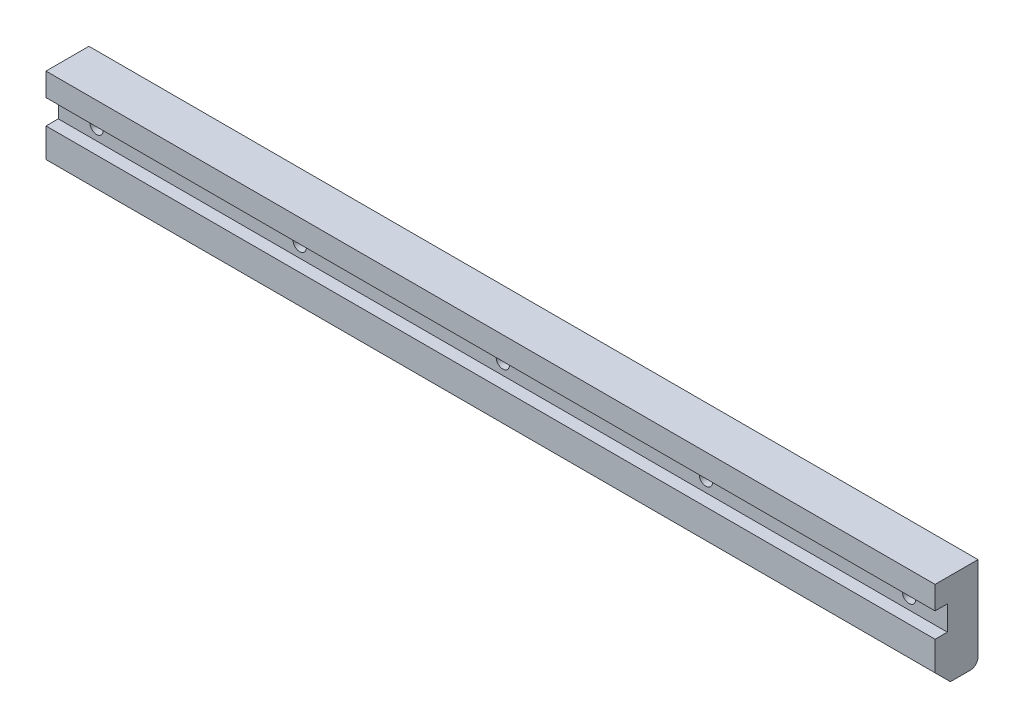
ISO-10303-21;
HEADER;
FILE_DESCRIPTION(('STEP AP214'),'2;1');
FILE_NAME('part.step','',(''),(''),'','','');
FILE_SCHEMA(('AUTOMOTIVE_DESIGN { 1 0 10303 214 1 1 1 1 }'));
ENDSEC;
DATA;
#1=APPLICATION_CONTEXT('core data for automotive mechanical design processes');
#2=APPLICATION_PROTOCOL_DEFINITION('international standard','automotive_design',2000,#1);
#3=PRODUCT_CONTEXT('',#1,'mechanical');
#4=PRODUCT('Part','Part','',(#3));
#5=PRODUCT_RELATED_PRODUCT_CATEGORY('part','',(#4));
#6=PRODUCT_DEFINITION_FORMATION('','',#4);
#7=PRODUCT_DEFINITION_CONTEXT('part definition',#1,'design');
#8=PRODUCT_DEFINITION('design','',#6,#7);
#9=PRODUCT_DEFINITION_SHAPE('','',#8);
#10=(LENGTH_UNIT() NAMED_UNIT(*) SI_UNIT(.MILLI.,.METRE.));
#11=(NAMED_UNIT(*) PLANE_ANGLE_UNIT() SI_UNIT($,.RADIAN.));
#12=(NAMED_UNIT(*) SI_UNIT($,.STERADIAN.) SOLID_ANGLE_UNIT());
#13=UNCERTAINTY_MEASURE_WITH_UNIT(LENGTH_MEASURE(1.E-05),#10,'distance_accuracy_value','');
#14=(GEOMETRIC_REPRESENTATION_CONTEXT(3) GLOBAL_UNCERTAINTY_ASSIGNED_CONTEXT((#13)) GLOBAL_UNIT_ASSIGNED_CONTEXT((#10,
#11,#12)) REPRESENTATION_CONTEXT('',''));
#15=CARTESIAN_POINT('',(0.,0.,0.));
#16=DIRECTION('',(0.,0.,1.));
#17=DIRECTION('',(1.,0.,0.));
#18=AXIS2_PLACEMENT_3D('',#15,#16,#17);
#19=CARTESIAN_POINT('',(265.,37.,20.));
#20=DIRECTION('',(0.,0.,1.));
#21=DIRECTION('',(1.,0.,0.));
#22=AXIS2_PLACEMENT_3D('',#19,#20,#21);
#23=CYLINDRICAL_SURFACE('',#22,4.32349999999998);
#24=CARTESIAN_POINT('',(265.,37.,0.));
#25=DIRECTION('',(0.,0.,-1.));
#26=DIRECTION('',(-1.,0.,0.));
#27=AXIS2_PLACEMENT_3D('',#24,#25,#26);
#28=CIRCLE('',#27,4.32349999999998);
#29=CARTESIAN_POINT('',(260.6765,37.,0.));
#30=VERTEX_POINT('',#29);
#31=EDGE_CURVE('E195',#30,#30,#28,.T.);
#32=ORIENTED_EDGE('',*,*,#31,.T.);
#33=EDGE_LOOP('',(#32));
#34=FACE_BOUND('',#33,.T.);
#35=CARTESIAN_POINT('',(265.,37.,20.));
#36=DIRECTION('',(0.,0.,1.));
#37=DIRECTION('',(1.,0.,0.));
#38=AXIS2_PLACEMENT_3D('',#35,#36,#37);
#39=CIRCLE('',#38,4.32349999999998);
#40=CARTESIAN_POINT('',(269.3235,37.,20.));
#41=VERTEX_POINT('',#40);
#42=EDGE_CURVE('E198',#41,#41,#39,.T.);
#43=ORIENTED_EDGE('',*,*,#42,.T.);
#44=EDGE_LOOP('',(#43));
#45=FACE_BOUND('',#44,.T.);
#46=ADVANCED_FACE('F33',(#34,#45),#23,.F.);
#47=CARTESIAN_POINT('',(132.5,37.,20.));
#48=DIRECTION('',(0.,0.,1.));
#49=DIRECTION('',(1.,0.,0.));
#50=AXIS2_PLACEMENT_3D('',#47,#48,#49);
#51=CYLINDRICAL_SURFACE('',#50,4.32349999999998);
#52=CARTESIAN_POINT('',(132.5,37.,0.));
#53=DIRECTION('',(0.,0.,-1.));
#54=DIRECTION('',(-1.,0.,0.));
#55=AXIS2_PLACEMENT_3D('',#52,#53,#54);
#56=CIRCLE('',#55,4.32349999999998);
#57=CARTESIAN_POINT('',(128.1765,37.,0.));
#58=VERTEX_POINT('',#57);
#59=EDGE_CURVE('E189',#58,#58,#56,.T.);
#60=ORIENTED_EDGE('',*,*,#59,.T.);
#61=EDGE_LOOP('',(#60));
#62=FACE_BOUND('',#61,.T.);
#63=CARTESIAN_POINT('',(132.5,37.,20.));
#64=DIRECTION('',(0.,0.,1.));
#65=DIRECTION('',(1.,0.,0.));
#66=AXIS2_PLACEMENT_3D('',#63,#64,#65);
#67=CIRCLE('',#66,4.32349999999998);
#68=CARTESIAN_POINT('',(136.8235,37.,20.));
#69=VERTEX_POINT('',#68);
#70=EDGE_CURVE('E192',#69,#69,#67,.T.);
#71=ORIENTED_EDGE('',*,*,#70,.T.);
#72=EDGE_LOOP('',(#71));
#73=FACE_BOUND('',#72,.T.);
#74=ADVANCED_FACE('F257',(#62,#73),#51,.F.);
#75=CARTESIAN_POINT('',(0.,37.,20.));
#76=DIRECTION('',(0.,0.,1.));
#77=DIRECTION('',(1.,0.,0.));
#78=AXIS2_PLACEMENT_3D('',#75,#76,#77);
#79=CYLINDRICAL_SURFACE('',#78,4.32349999999998);
#80=CARTESIAN_POINT('',(0.,37.,0.));
#81=DIRECTION('',(0.,0.,-1.));
#82=DIRECTION('',(-1.,0.,0.));
#83=AXIS2_PLACEMENT_3D('',#80,#81,#82);
#84=CIRCLE('',#83,4.32349999999998);
#85=CARTESIAN_POINT('',(-4.32349999999998,37.,0.));
#86=VERTEX_POINT('',#85);
#87=EDGE_CURVE('E172',#86,#86,#84,.T.);
#88=ORIENTED_EDGE('',*,*,#87,.T.);
#89=EDGE_LOOP('',(#88));
#90=FACE_BOUND('',#89,.T.);
#91=CARTESIAN_POINT('',(0.,37.,20.));
#92=DIRECTION('',(0.,0.,1.));
#93=DIRECTION('',(1.,0.,0.));
#94=AXIS2_PLACEMENT_3D('',#91,#92,#93);
#95=CIRCLE('',#94,4.32349999999998);
#96=CARTESIAN_POINT('',(4.32349999999998,37.,20.));
#97=VERTEX_POINT('',#96);
#98=EDGE_CURVE('E186',#97,#97,#95,.T.);
#99=ORIENTED_EDGE('',*,*,#98,.T.);
#100=EDGE_LOOP('',(#99));
#101=FACE_BOUND('',#100,.T.);
#102=ADVANCED_FACE('F262',(#90,#101),#79,.F.);
#103=CARTESIAN_POINT('',(-290.,0.,18.));
#104=DIRECTION('',(0.,-1.,0.));
#105=DIRECTION('',(0.,0.,-1.));
#106=AXIS2_PLACEMENT_3D('',#103,#104,#105);
#107=PLANE('',#106);
#108=DIRECTION('',(0.,0.,-1.));
#109=VECTOR('',#108,1.);
#110=CARTESIAN_POINT('',(-290.,0.,18.));
#111=LINE('',#110,#109);
#112=CARTESIAN_POINT('',(-290.,0.,18.));
#113=VERTEX_POINT('',#112);
#114=CARTESIAN_POINT('',(-290.,0.,5.));
#115=VERTEX_POINT('',#114);
#116=EDGE_CURVE('E147',#113,#115,#111,.T.);
#117=ORIENTED_EDGE('',*,*,#116,.T.);
#118=DIRECTION('',(1.,0.,0.));
#119=VECTOR('',#118,1.);
#120=CARTESIAN_POINT('',(-290.,0.,5.));
#121=LINE('',#120,#119);
#122=CARTESIAN_POINT('',(290.,0.,5.));
#123=VERTEX_POINT('',#122);
#124=EDGE_CURVE('E201',#115,#123,#121,.T.);
#125=ORIENTED_EDGE('',*,*,#124,.T.);
#126=DIRECTION('',(0.,0.,-1.));
#127=VECTOR('',#126,1.);
#128=CARTESIAN_POINT('',(290.,0.,18.));
#129=LINE('',#128,#127);
#130=CARTESIAN_POINT('',(290.,0.,18.));
#131=VERTEX_POINT('',#130);
#132=EDGE_CURVE('E113',#131,#123,#129,.T.);
#133=ORIENTED_EDGE('',*,*,#132,.F.);
#134=DIRECTION('',(1.,0.,0.));
#135=VECTOR('',#134,1.);
#136=CARTESIAN_POINT('',(-290.,0.,18.));
#137=LINE('',#136,#135);
#138=EDGE_CURVE('E170',#113,#131,#137,.T.);
#139=ORIENTED_EDGE('',*,*,#138,.F.);
#140=EDGE_LOOP('',(#117,#125,#133,#139));
#141=FACE_BOUND('',#140,.T.);
#142=ADVANCED_FACE('F207',(#141),#107,.T.);
#143=CARTESIAN_POINT('',(-290.,10.,28.));
#144=DIRECTION('',(0.,-0.707106781186547,0.707106781186548));
#145=DIRECTION('',(0.,-0.707106781186548,-0.707106781186547));
#146=AXIS2_PLACEMENT_3D('',#143,#144,#145);
#147=PLANE('',#146);
#148=ORIENTED_EDGE('',*,*,#138,.T.);
#149=DIRECTION('',(0.,-0.707106781186548,-0.707106781186547));
#150=VECTOR('',#149,1.);
#151=CARTESIAN_POINT('',(290.,10.,28.));
#152=LINE('',#151,#150);
#153=CARTESIAN_POINT('',(290.,10.,28.));
#154=VERTEX_POINT('',#153);
#155=EDGE_CURVE('E144',#154,#131,#152,.T.);
#156=ORIENTED_EDGE('',*,*,#155,.F.);
#157=DIRECTION('',(1.,0.,0.));
#158=VECTOR('',#157,1.);
#159=CARTESIAN_POINT('',(-290.,10.,28.));
#160=LINE('',#159,#158);
#161=CARTESIAN_POINT('',(-290.,10.,28.));
#162=VERTEX_POINT('',#161);
#163=EDGE_CURVE('E173',#162,#154,#160,.T.);
#164=ORIENTED_EDGE('',*,*,#163,.F.);
#165=DIRECTION('',(0.,-0.707106781186548,-0.707106781186547));
#166=VECTOR('',#165,1.);
#167=CARTESIAN_POINT('',(-290.,10.,28.));
#168=LINE('',#167,#166);
#169=EDGE_CURVE('E124',#162,#113,#168,.T.);
#170=ORIENTED_EDGE('',*,*,#169,.T.);
#171=EDGE_LOOP('',(#148,#156,#164,#170));
#172=FACE_BOUND('',#171,.T.);
#173=ADVANCED_FACE('F270',(#172),#147,.T.);
#174=CARTESIAN_POINT('',(-290.,29.,28.));
#175=DIRECTION('',(0.,0.,1.));
#176=DIRECTION('',(0.,-1.,0.));
#177=AXIS2_PLACEMENT_3D('',#174,#175,#176);
#178=PLANE('',#177);
#179=ORIENTED_EDGE('',*,*,#163,.T.);
#180=DIRECTION('',(0.,-1.,0.));
#181=VECTOR('',#180,1.);
#182=CARTESIAN_POINT('',(290.,29.,28.));
#183=LINE('',#182,#181);
#184=CARTESIAN_POINT('',(290.,29.,28.));
#185=VERTEX_POINT('',#184);
#186=EDGE_CURVE('E141',#185,#154,#183,.T.);
#187=ORIENTED_EDGE('',*,*,#186,.F.);
#188=DIRECTION('',(1.,0.,0.));
#189=VECTOR('',#188,1.);
#190=CARTESIAN_POINT('',(-290.,29.,28.));
#191=LINE('',#190,#189);
#192=CARTESIAN_POINT('',(-290.,29.,28.));
#193=VERTEX_POINT('',#192);
#194=EDGE_CURVE('E175',#193,#185,#191,.T.);
#195=ORIENTED_EDGE('',*,*,#194,.F.);
#196=DIRECTION('',(0.,-1.,0.));
#197=VECTOR('',#196,1.);
#198=CARTESIAN_POINT('',(-290.,29.,28.));
#199=LINE('',#198,#197);
#200=EDGE_CURVE('E165',#193,#162,#199,.T.);
#201=ORIENTED_EDGE('',*,*,#200,.T.);
#202=EDGE_LOOP('',(#179,#187,#195,#201));
#203=FACE_BOUND('',#202,.T.);
#204=ADVANCED_FACE('F283',(#203),#178,.T.);
#205=CARTESIAN_POINT('',(-290.,29.,20.));
#206=DIRECTION('',(0.,1.,0.));
#207=DIRECTION('',(0.,0.,1.));
#208=AXIS2_PLACEMENT_3D('',#205,#206,#207);
#209=PLANE('',#208);
#210=ORIENTED_EDGE('',*,*,#194,.T.);
#211=DIRECTION('',(0.,0.,1.));
#212=VECTOR('',#211,1.);
#213=CARTESIAN_POINT('',(290.,29.,20.));
#214=LINE('',#213,#212);
#215=CARTESIAN_POINT('',(290.,29.,20.));
#216=VERTEX_POINT('',#215);
#217=EDGE_CURVE('E138',#216,#185,#214,.T.);
#218=ORIENTED_EDGE('',*,*,#217,.F.);
#219=DIRECTION('',(1.,0.,0.));
#220=VECTOR('',#219,1.);
#221=CARTESIAN_POINT('',(-290.,29.,20.));
#222=LINE('',#221,#220);
#223=CARTESIAN_POINT('',(-290.,29.,20.));
#224=VERTEX_POINT('',#223);
#225=EDGE_CURVE('E177',#224,#216,#222,.T.);
#226=ORIENTED_EDGE('',*,*,#225,.F.);
#227=DIRECTION('',(0.,0.,1.));
#228=VECTOR('',#227,1.);
#229=CARTESIAN_POINT('',(-290.,29.,20.));
#230=LINE('',#229,#228);
#231=EDGE_CURVE('E162',#224,#193,#230,.T.);
#232=ORIENTED_EDGE('',*,*,#231,.T.);
#233=EDGE_LOOP('',(#210,#218,#226,#232));
#234=FACE_BOUND('',#233,.T.);
#235=ADVANCED_FACE('F245',(#234),#209,.T.);
#236=CARTESIAN_POINT('',(-290.,45.,20.));
#237=DIRECTION('',(0.,0.,1.));
#238=DIRECTION('',(1.,0.,0.));
#239=AXIS2_PLACEMENT_3D('',#236,#237,#238);
#240=PLANE('',#239);
#241=CARTESIAN_POINT('',(-132.5,37.,20.));
#242=DIRECTION('',(0.,0.,1.));
#243=DIRECTION('',(1.,0.,0.));
#244=AXIS2_PLACEMENT_3D('',#241,#242,#243);
#245=CIRCLE('',#244,4.32349999999998);
#246=CARTESIAN_POINT('',(-128.1765,37.,20.));
#247=VERTEX_POINT('',#246);
#248=EDGE_CURVE('E219',#247,#247,#245,.T.);
#249=ORIENTED_EDGE('',*,*,#248,.F.);
#250=EDGE_LOOP('',(#249));
#251=FACE_BOUND('',#250,.T.);
#252=CARTESIAN_POINT('',(-265.,37.,20.));
#253=DIRECTION('',(0.,0.,1.));
#254=DIRECTION('',(1.,0.,0.));
#255=AXIS2_PLACEMENT_3D('',#252,#253,#254);
#256=CIRCLE('',#255,4.32349999999998);
#257=CARTESIAN_POINT('',(-260.6765,37.,20.));
#258=VERTEX_POINT('',#257);
#259=EDGE_CURVE('E214',#258,#258,#256,.T.);
#260=ORIENTED_EDGE('',*,*,#259,.F.);
#261=EDGE_LOOP('',(#260));
#262=FACE_BOUND('',#261,.T.);
#263=ORIENTED_EDGE('',*,*,#225,.T.);
#264=DIRECTION('',(0.,-1.,0.));
#265=VECTOR('',#264,1.);
#266=CARTESIAN_POINT('',(290.,45.,20.));
#267=LINE('',#266,#265);
#268=CARTESIAN_POINT('',(290.,45.,20.));
#269=VERTEX_POINT('',#268);
#270=EDGE_CURVE('E135',#269,#216,#267,.T.);
#271=ORIENTED_EDGE('',*,*,#270,.F.);
#272=DIRECTION('',(1.,0.,0.));
#273=VECTOR('',#272,1.);
#274=CARTESIAN_POINT('',(-290.,45.,20.));
#275=LINE('',#274,#273);
#276=CARTESIAN_POINT('',(-290.,45.,20.));
#277=VERTEX_POINT('',#276);
#278=EDGE_CURVE('E179',#277,#269,#275,.T.);
#279=ORIENTED_EDGE('',*,*,#278,.F.);
#280=DIRECTION('',(0.,-1.,0.));
#281=VECTOR('',#280,1.);
#282=CARTESIAN_POINT('',(-290.,45.,20.));
#283=LINE('',#282,#281);
#284=EDGE_CURVE('E159',#277,#224,#283,.T.);
#285=ORIENTED_EDGE('',*,*,#284,.T.);
#286=EDGE_LOOP('',(#263,#271,#279,#285));
#287=FACE_BOUND('',#286,.T.);
#288=ORIENTED_EDGE('',*,*,#98,.F.);
#289=EDGE_LOOP('',(#288));
#290=FACE_BOUND('',#289,.T.);
#291=ORIENTED_EDGE('',*,*,#70,.F.);
#292=EDGE_LOOP('',(#291));
#293=FACE_BOUND('',#292,.T.);
#294=ORIENTED_EDGE('',*,*,#42,.F.);
#295=EDGE_LOOP('',(#294));
#296=FACE_BOUND('',#295,.T.);
#297=ADVANCED_FACE('F241',(#251,#262,#287,#290,#293,#296),#240,.T.);
#298=CARTESIAN_POINT('',(-290.,45.,28.));
#299=DIRECTION('',(0.,-1.,0.));
#300=DIRECTION('',(0.,0.,-1.));
#301=AXIS2_PLACEMENT_3D('',#298,#299,#300);
#302=PLANE('',#301);
#303=ORIENTED_EDGE('',*,*,#278,.T.);
#304=DIRECTION('',(0.,0.,-1.));
#305=VECTOR('',#304,1.);
#306=CARTESIAN_POINT('',(290.,45.,28.));
#307=LINE('',#306,#305);
#308=CARTESIAN_POINT('',(290.,45.,28.));
#309=VERTEX_POINT('',#308);
#310=EDGE_CURVE('E129',#309,#269,#307,.T.);
#311=ORIENTED_EDGE('',*,*,#310,.F.);
#312=DIRECTION('',(1.,0.,0.));
#313=VECTOR('',#312,1.);
#314=CARTESIAN_POINT('',(-290.,45.,28.));
#315=LINE('',#314,#313);
#316=CARTESIAN_POINT('',(-290.,45.,28.));
#317=VERTEX_POINT('',#316);
#318=EDGE_CURVE('E181',#317,#309,#315,.T.);
#319=ORIENTED_EDGE('',*,*,#318,.F.);
#320=DIRECTION('',(0.,0.,-1.));
#321=VECTOR('',#320,1.);
#322=CARTESIAN_POINT('',(-290.,45.,28.));
#323=LINE('',#322,#321);
#324=EDGE_CURVE('E156',#317,#277,#323,.T.);
#325=ORIENTED_EDGE('',*,*,#324,.T.);
#326=EDGE_LOOP('',(#303,#311,#319,#325));
#327=FACE_BOUND('',#326,.T.);
#328=ADVANCED_FACE('F244',(#327),#302,.T.);
#329=CARTESIAN_POINT('',(-290.,60.,28.));
#330=DIRECTION('',(0.,0.,1.));
#331=DIRECTION('',(1.,0.,0.));
#332=AXIS2_PLACEMENT_3D('',#329,#330,#331);
#333=PLANE('',#332);
#334=ORIENTED_EDGE('',*,*,#318,.T.);
#335=DIRECTION('',(0.,-1.,0.));
#336=VECTOR('',#335,1.);
#337=CARTESIAN_POINT('',(290.,60.,28.));
#338=LINE('',#337,#336);
#339=CARTESIAN_POINT('',(290.,60.,28.));
#340=VERTEX_POINT('',#339);
#341=EDGE_CURVE('E127',#340,#309,#338,.T.);
#342=ORIENTED_EDGE('',*,*,#341,.F.);
#343=DIRECTION('',(1.,0.,0.));
#344=VECTOR('',#343,1.);
#345=CARTESIAN_POINT('',(-290.,60.,28.));
#346=LINE('',#345,#344);
#347=CARTESIAN_POINT('',(-290.,60.,28.));
#348=VERTEX_POINT('',#347);
#349=EDGE_CURVE('E123',#348,#340,#346,.T.);
#350=ORIENTED_EDGE('',*,*,#349,.F.);
#351=DIRECTION('',(0.,-1.,0.));
#352=VECTOR('',#351,1.);
#353=CARTESIAN_POINT('',(-290.,60.,28.));
#354=LINE('',#353,#352);
#355=EDGE_CURVE('E153',#348,#317,#354,.T.);
#356=ORIENTED_EDGE('',*,*,#355,.T.);
#357=EDGE_LOOP('',(#334,#342,#350,#356));
#358=FACE_BOUND('',#357,.T.);
#359=ADVANCED_FACE('F274',(#358),#333,.T.);
#360=CARTESIAN_POINT('',(-290.,60.,0.));
#361=DIRECTION('',(0.,1.,0.));
#362=DIRECTION('',(0.,0.,1.));
#363=AXIS2_PLACEMENT_3D('',#360,#361,#362);
#364=PLANE('',#363);
#365=ORIENTED_EDGE('',*,*,#349,.T.);
#366=DIRECTION('',(0.,0.,1.));
#367=VECTOR('',#366,1.);
#368=CARTESIAN_POINT('',(290.,60.,0.));
#369=LINE('',#368,#367);
#370=CARTESIAN_POINT('',(290.,60.,0.));
#371=VERTEX_POINT('',#370);
#372=EDGE_CURVE('E111',#371,#340,#369,.T.);
#373=ORIENTED_EDGE('',*,*,#372,.F.);
#374=DIRECTION('',(1.,0.,0.));
#375=VECTOR('',#374,1.);
#376=CARTESIAN_POINT('',(-290.,60.,0.));
#377=LINE('',#376,#375);
#378=CARTESIAN_POINT('',(-290.,60.,0.));
#379=VERTEX_POINT('',#378);
#380=EDGE_CURVE('E116',#379,#371,#377,.T.);
#381=ORIENTED_EDGE('',*,*,#380,.F.);
#382=DIRECTION('',(0.,0.,1.));
#383=VECTOR('',#382,1.);
#384=CARTESIAN_POINT('',(-290.,60.,0.));
#385=LINE('',#384,#383);
#386=EDGE_CURVE('E151',#379,#348,#385,.T.);
#387=ORIENTED_EDGE('',*,*,#386,.T.);
#388=EDGE_LOOP('',(#365,#373,#381,#387));
#389=FACE_BOUND('',#388,.T.);
#390=ADVANCED_FACE('F126',(#389),#364,.T.);
#391=CARTESIAN_POINT('',(-290.,0.,0.));
#392=DIRECTION('',(0.,0.,-1.));
#393=DIRECTION('',(-1.,0.,0.));
#394=AXIS2_PLACEMENT_3D('',#391,#392,#393);
#395=PLANE('',#394);
#396=CARTESIAN_POINT('',(-132.5,37.,0.));
#397=DIRECTION('',(0.,0.,-1.));
#398=DIRECTION('',(-1.,0.,0.));
#399=AXIS2_PLACEMENT_3D('',#396,#397,#398);
#400=CIRCLE('',#399,4.32349999999998);
#401=CARTESIAN_POINT('',(-136.8235,37.,0.));
#402=VERTEX_POINT('',#401);
#403=EDGE_CURVE('E222',#402,#402,#400,.T.);
#404=ORIENTED_EDGE('',*,*,#403,.F.);
#405=EDGE_LOOP('',(#404));
#406=FACE_BOUND('',#405,.T.);
#407=CARTESIAN_POINT('',(-265.,37.,0.));
#408=DIRECTION('',(0.,0.,-1.));
#409=DIRECTION('',(-1.,0.,0.));
#410=AXIS2_PLACEMENT_3D('',#407,#408,#409);
#411=CIRCLE('',#410,4.32349999999998);
#412=CARTESIAN_POINT('',(-269.3235,37.,0.));
#413=VERTEX_POINT('',#412);
#414=EDGE_CURVE('E212',#413,#413,#411,.T.);
#415=ORIENTED_EDGE('',*,*,#414,.F.);
#416=EDGE_LOOP('',(#415));
#417=FACE_BOUND('',#416,.T.);
#418=DIRECTION('',(0.,1.,0.));
#419=VECTOR('',#418,1.);
#420=CARTESIAN_POINT('',(290.,0.,0.));
#421=LINE('',#420,#419);
#422=CARTESIAN_POINT('',(290.,5.,0.));
#423=VERTEX_POINT('',#422);
#424=EDGE_CURVE('E106',#423,#371,#421,.T.);
#425=ORIENTED_EDGE('',*,*,#424,.F.);
#426=DIRECTION('',(1.,0.,0.));
#427=VECTOR('',#426,1.);
#428=CARTESIAN_POINT('',(-290.,5.,0.));
#429=LINE('',#428,#427);
#430=CARTESIAN_POINT('',(-290.,5.,0.));
#431=VERTEX_POINT('',#430);
#432=EDGE_CURVE('E41',#423,#431,#429,.F.);
#433=ORIENTED_EDGE('',*,*,#432,.T.);
#434=DIRECTION('',(0.,1.,0.));
#435=VECTOR('',#434,1.);
#436=CARTESIAN_POINT('',(-290.,0.,0.));
#437=LINE('',#436,#435);
#438=EDGE_CURVE('E119',#431,#379,#437,.T.);
#439=ORIENTED_EDGE('',*,*,#438,.T.);
#440=ORIENTED_EDGE('',*,*,#380,.T.);
#441=EDGE_LOOP('',(#425,#433,#439,#440));
#442=FACE_BOUND('',#441,.T.);
#443=ORIENTED_EDGE('',*,*,#87,.F.);
#444=EDGE_LOOP('',(#443));
#445=FACE_BOUND('',#444,.T.);
#446=ORIENTED_EDGE('',*,*,#59,.F.);
#447=EDGE_LOOP('',(#446));
#448=FACE_BOUND('',#447,.T.);
#449=ORIENTED_EDGE('',*,*,#31,.F.);
#450=EDGE_LOOP('',(#449));
#451=FACE_BOUND('',#450,.T.);
#452=ADVANCED_FACE('F117',(#406,#417,#442,#445,#448,#451),#395,.T.);
#453=CARTESIAN_POINT('',(-290.,0.,0.));
#454=DIRECTION('',(1.,0.,0.));
#455=DIRECTION('',(0.,0.,-1.));
#456=AXIS2_PLACEMENT_3D('',#453,#454,#455);
#457=PLANE('',#456);
#458=ORIENTED_EDGE('',*,*,#438,.F.);
#459=CARTESIAN_POINT('',(-290.,5.,5.));
#460=DIRECTION('',(1.,0.,0.));
#461=DIRECTION('',(0.,0.,-1.));
#462=AXIS2_PLACEMENT_3D('',#459,#460,#461);
#463=CIRCLE('',#462,5.);
#464=EDGE_CURVE('E11',#431,#115,#463,.F.);
#465=ORIENTED_EDGE('',*,*,#464,.T.);
#466=ORIENTED_EDGE('',*,*,#116,.F.);
#467=ORIENTED_EDGE('',*,*,#169,.F.);
#468=ORIENTED_EDGE('',*,*,#200,.F.);
#469=ORIENTED_EDGE('',*,*,#231,.F.);
#470=ORIENTED_EDGE('',*,*,#284,.F.);
#471=ORIENTED_EDGE('',*,*,#324,.F.);
#472=ORIENTED_EDGE('',*,*,#355,.F.);
#473=ORIENTED_EDGE('',*,*,#386,.F.);
#474=EDGE_LOOP('',(#458,#465,#466,#467,#468,#469,#470,#471,#472,#473));
#475=FACE_BOUND('',#474,.T.);
#476=ADVANCED_FACE('F231',(#475),#457,.F.);
#477=CARTESIAN_POINT('',(290.,0.,0.));
#478=DIRECTION('',(1.,0.,0.));
#479=DIRECTION('',(0.,0.,-1.));
#480=AXIS2_PLACEMENT_3D('',#477,#478,#479);
#481=PLANE('',#480);
#482=ORIENTED_EDGE('',*,*,#132,.T.);
#483=CARTESIAN_POINT('',(290.,5.,5.));
#484=DIRECTION('',(1.,0.,0.));
#485=DIRECTION('',(0.,0.,-1.));
#486=AXIS2_PLACEMENT_3D('',#483,#484,#485);
#487=CIRCLE('',#486,5.);
#488=EDGE_CURVE('E55',#123,#423,#487,.T.);
#489=ORIENTED_EDGE('',*,*,#488,.T.);
#490=ORIENTED_EDGE('',*,*,#424,.T.);
#491=ORIENTED_EDGE('',*,*,#372,.T.);
#492=ORIENTED_EDGE('',*,*,#341,.T.);
#493=ORIENTED_EDGE('',*,*,#310,.T.);
#494=ORIENTED_EDGE('',*,*,#270,.T.);
#495=ORIENTED_EDGE('',*,*,#217,.T.);
#496=ORIENTED_EDGE('',*,*,#186,.T.);
#497=ORIENTED_EDGE('',*,*,#155,.T.);
#498=EDGE_LOOP('',(#482,#489,#490,#491,#492,#493,#494,#495,#496,#497));
#499=FACE_BOUND('',#498,.T.);
#500=ADVANCED_FACE('F108',(#499),#481,.T.);
#501=CARTESIAN_POINT('',(-265.,37.,20.));
#502=DIRECTION('',(0.,0.,1.));
#503=DIRECTION('',(1.,0.,0.));
#504=AXIS2_PLACEMENT_3D('',#501,#502,#503);
#505=CYLINDRICAL_SURFACE('',#504,4.32349999999998);
#506=ORIENTED_EDGE('',*,*,#414,.T.);
#507=EDGE_LOOP('',(#506));
#508=FACE_BOUND('',#507,.T.);
#509=ORIENTED_EDGE('',*,*,#259,.T.);
#510=EDGE_LOOP('',(#509));
#511=FACE_BOUND('',#510,.T.);
#512=ADVANCED_FACE('F235',(#508,#511),#505,.F.);
#513=CARTESIAN_POINT('',(-132.5,37.,20.));
#514=DIRECTION('',(0.,0.,1.));
#515=DIRECTION('',(1.,0.,0.));
#516=AXIS2_PLACEMENT_3D('',#513,#514,#515);
#517=CYLINDRICAL_SURFACE('',#516,4.32349999999998);
#518=ORIENTED_EDGE('',*,*,#403,.T.);
#519=EDGE_LOOP('',(#518));
#520=FACE_BOUND('',#519,.T.);
#521=ORIENTED_EDGE('',*,*,#248,.T.);
#522=EDGE_LOOP('',(#521));
#523=FACE_BOUND('',#522,.T.);
#524=ADVANCED_FACE('F226',(#520,#523),#517,.F.);
#525=CARTESIAN_POINT('',(-290.,5.,5.));
#526=DIRECTION('',(1.,0.,0.));
#527=DIRECTION('',(0.,0.,-1.));
#528=AXIS2_PLACEMENT_3D('',#525,#526,#527);
#529=CYLINDRICAL_SURFACE('',#528,5.);
#530=ORIENTED_EDGE('',*,*,#464,.F.);
#531=ORIENTED_EDGE('',*,*,#432,.F.);
#532=ORIENTED_EDGE('',*,*,#488,.F.);
#533=ORIENTED_EDGE('',*,*,#124,.F.);
#534=EDGE_LOOP('',(#530,#531,#532,#533));
#535=FACE_BOUND('',#534,.T.);
#536=ADVANCED_FACE('F35',(#535),#529,.T.);
#537=CLOSED_SHELL('',(#46,#74,#102,#142,#173,#204,#235,#297,#328,#359,#390,#452,#476,#500,#512,
#524,#536));
#538=MANIFOLD_SOLID_BREP('B2',#537);
#539=ADVANCED_BREP_SHAPE_REPRESENTATION('',(#18,#538),#14);
#540=SHAPE_DEFINITION_REPRESENTATION(#9,#539);
ENDSEC;
END-ISO-10303-21;
